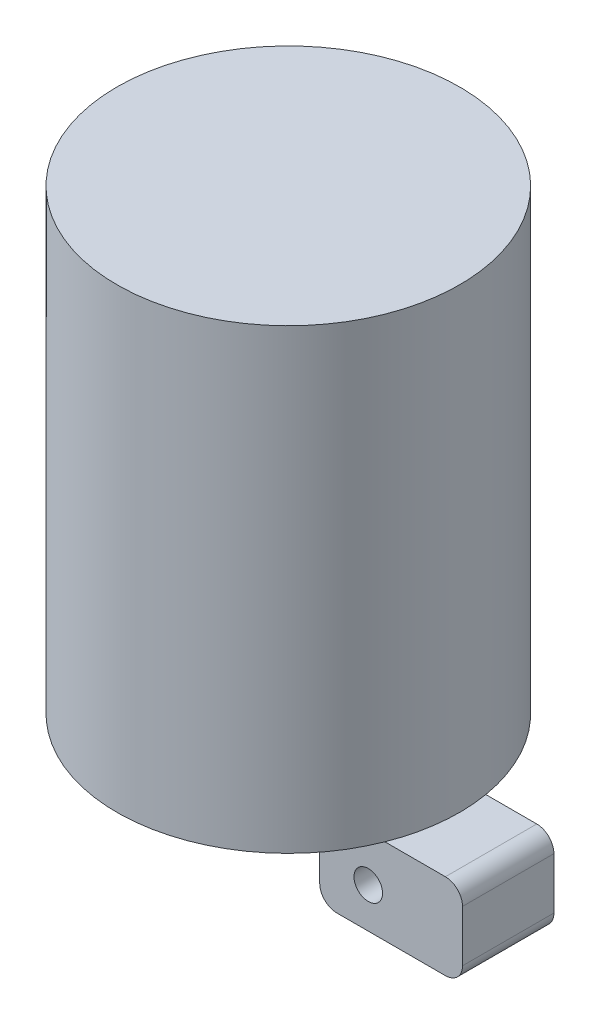
ISO-10303-21;
HEADER;
FILE_DESCRIPTION(('STEP AP214'),'2;1');
FILE_NAME('part.step','',(''),(''),'','','');
FILE_SCHEMA(('AUTOMOTIVE_DESIGN { 1 0 10303 214 1 1 1 1 }'));
ENDSEC;
DATA;
#1=APPLICATION_CONTEXT('core data for automotive mechanical design processes');
#2=APPLICATION_PROTOCOL_DEFINITION('international standard','automotive_design',2000,#1);
#3=PRODUCT_CONTEXT('',#1,'mechanical');
#4=PRODUCT('Part','Part','',(#3));
#5=PRODUCT_RELATED_PRODUCT_CATEGORY('part','',(#4));
#6=PRODUCT_DEFINITION_FORMATION('','',#4);
#7=PRODUCT_DEFINITION_CONTEXT('part definition',#1,'design');
#8=PRODUCT_DEFINITION('design','',#6,#7);
#9=PRODUCT_DEFINITION_SHAPE('','',#8);
#10=(LENGTH_UNIT() NAMED_UNIT(*) SI_UNIT(.MILLI.,.METRE.));
#11=(NAMED_UNIT(*) PLANE_ANGLE_UNIT() SI_UNIT($,.RADIAN.));
#12=(NAMED_UNIT(*) SI_UNIT($,.STERADIAN.) SOLID_ANGLE_UNIT());
#13=UNCERTAINTY_MEASURE_WITH_UNIT(LENGTH_MEASURE(1.E-05),#10,'distance_accuracy_value','');
#14=(GEOMETRIC_REPRESENTATION_CONTEXT(3) GLOBAL_UNCERTAINTY_ASSIGNED_CONTEXT((#13)) GLOBAL_UNIT_ASSIGNED_CONTEXT((#10,
#11,#12)) REPRESENTATION_CONTEXT('',''));
#15=CARTESIAN_POINT('',(0.,0.,0.));
#16=DIRECTION('',(0.,0.,1.));
#17=DIRECTION('',(1.,0.,0.));
#18=AXIS2_PLACEMENT_3D('',#15,#16,#17);
#19=CARTESIAN_POINT('',(0.,0.,0.));
#20=DIRECTION('',(0.,1.,0.));
#21=DIRECTION('',(-1.,0.,0.));
#22=AXIS2_PLACEMENT_3D('',#19,#20,#21);
#23=PLANE('',#22);
#24=CARTESIAN_POINT('',(30.,0.,0.));
#25=DIRECTION('',(0.,1.,0.));
#26=DIRECTION('',(-1.,0.,0.));
#27=AXIS2_PLACEMENT_3D('',#24,#25,#26);
#28=CIRCLE('',#27,12.5);
#29=CARTESIAN_POINT('',(17.5,0.,0.));
#30=VERTEX_POINT('',#29);
#31=EDGE_CURVE('E45',#30,#30,#28,.T.);
#32=ORIENTED_EDGE('',*,*,#31,.T.);
#33=EDGE_LOOP('',(#32));
#34=FACE_BOUND('',#33,.T.);
#35=DIRECTION('',(-1.,0.,0.));
#36=VECTOR('',#35,1.);
#37=CARTESIAN_POINT('',(68.5,0.,-5.));
#38=LINE('',#37,#36);
#39=CARTESIAN_POINT('',(59.5803989154981,0.,-5.));
#40=VERTEX_POINT('',#39);
#41=CARTESIAN_POINT('',(46.5,0.,-5.));
#42=VERTEX_POINT('',#41);
#43=EDGE_CURVE('E126',#40,#42,#38,.T.);
#44=ORIENTED_EDGE('',*,*,#43,.T.);
#45=DIRECTION('',(0.,0.,1.));
#46=VECTOR('',#45,1.);
#47=CARTESIAN_POINT('',(46.5,0.,-5.));
#48=LINE('',#47,#46);
#49=CARTESIAN_POINT('',(46.5,0.,11.));
#50=VERTEX_POINT('',#49);
#51=EDGE_CURVE('E120',#42,#50,#48,.T.);
#52=ORIENTED_EDGE('',*,*,#51,.T.);
#53=DIRECTION('',(-1.,0.,0.));
#54=VECTOR('',#53,1.);
#55=CARTESIAN_POINT('',(68.5,0.,11.));
#56=LINE('',#55,#54);
#57=CARTESIAN_POINT('',(57.9105714739057,0.,11.));
#58=VERTEX_POINT('',#57);
#59=EDGE_CURVE('E102',#58,#50,#56,.T.);
#60=ORIENTED_EDGE('',*,*,#59,.F.);
#61=CARTESIAN_POINT('',(30.,0.,0.));
#62=DIRECTION('',(0.,1.,0.));
#63=DIRECTION('',(-1.,0.,0.));
#64=AXIS2_PLACEMENT_3D('',#61,#62,#63);
#65=CIRCLE('',#64,30.);
#66=EDGE_CURVE('E139',#40,#58,#65,.T.);
#67=ORIENTED_EDGE('',*,*,#66,.F.);
#68=EDGE_LOOP('',(#44,#52,#60,#67));
#69=FACE_BOUND('',#68,.T.);
#70=ADVANCED_FACE('F37',(#34,#69),#23,.F.);
#71=CARTESIAN_POINT('',(0.,80.,0.));
#72=DIRECTION('',(0.,1.,0.));
#73=DIRECTION('',(-1.,0.,0.));
#74=AXIS2_PLACEMENT_3D('',#71,#72,#73);
#75=PLANE('',#74);
#76=CARTESIAN_POINT('',(30.,80.,0.));
#77=DIRECTION('',(0.,1.,0.));
#78=DIRECTION('',(-1.,0.,0.));
#79=AXIS2_PLACEMENT_3D('',#76,#77,#78);
#80=CIRCLE('',#79,30.);
#81=CARTESIAN_POINT('',(0.,80.,0.));
#82=VERTEX_POINT('',#81);
#83=EDGE_CURVE('E136',#82,#82,#80,.T.);
#84=ORIENTED_EDGE('',*,*,#83,.T.);
#85=EDGE_LOOP('',(#84));
#86=FACE_BOUND('',#85,.T.);
#87=ADVANCED_FACE('F39',(#86),#75,.T.);
#88=CARTESIAN_POINT('',(0.,40.,0.));
#89=DIRECTION('',(0.,1.,0.));
#90=DIRECTION('',(-1.,0.,0.));
#91=AXIS2_PLACEMENT_3D('',#88,#89,#90);
#92=PLANE('',#91);
#93=CARTESIAN_POINT('',(30.,40.,0.));
#94=DIRECTION('',(0.,1.,0.));
#95=DIRECTION('',(-1.,0.,0.));
#96=AXIS2_PLACEMENT_3D('',#93,#94,#95);
#97=CIRCLE('',#96,12.5);
#98=CARTESIAN_POINT('',(17.5,40.,0.));
#99=VERTEX_POINT('',#98);
#100=EDGE_CURVE('E11',#99,#99,#97,.T.);
#101=ORIENTED_EDGE('',*,*,#100,.F.);
#102=EDGE_LOOP('',(#101));
#103=FACE_BOUND('',#102,.T.);
#104=ADVANCED_FACE('F148',(#103),#92,.F.);
#105=CARTESIAN_POINT('',(30.,80.,0.));
#106=DIRECTION('',(0.,1.,0.));
#107=DIRECTION('',(-1.,0.,0.));
#108=AXIS2_PLACEMENT_3D('',#105,#106,#107);
#109=CYLINDRICAL_SURFACE('',#108,12.5);
#110=ORIENTED_EDGE('',*,*,#100,.T.);
#111=EDGE_LOOP('',(#110));
#112=FACE_BOUND('',#111,.T.);
#113=ORIENTED_EDGE('',*,*,#31,.F.);
#114=EDGE_LOOP('',(#113));
#115=FACE_BOUND('',#114,.T.);
#116=ADVANCED_FACE('F145',(#112,#115),#109,.F.);
#117=CARTESIAN_POINT('',(30.,80.,0.));
#118=DIRECTION('',(0.,1.,0.));
#119=DIRECTION('',(-1.,0.,0.));
#120=AXIS2_PLACEMENT_3D('',#117,#118,#119);
#121=CYLINDRICAL_SURFACE('',#120,30.);
#122=EDGE_CURVE('E57',#58,#40,#65,.T.);
#123=ORIENTED_EDGE('',*,*,#122,.T.);
#124=ORIENTED_EDGE('',*,*,#66,.T.);
#125=EDGE_LOOP('',(#123,#124));
#126=FACE_BOUND('',#125,.T.);
#127=ORIENTED_EDGE('',*,*,#83,.F.);
#128=EDGE_LOOP('',(#127));
#129=FACE_BOUND('',#128,.T.);
#130=ADVANCED_FACE('F147',(#126,#129),#121,.T.);
#131=CARTESIAN_POINT('',(68.5,0.,-5.));
#132=DIRECTION('',(0.,1.,0.));
#133=DIRECTION('',(-1.,0.,0.));
#134=AXIS2_PLACEMENT_3D('',#131,#132,#133);
#135=PLANE('',#134);
#136=CARTESIAN_POINT('',(68.5,0.,-5.));
#137=VERTEX_POINT('',#136);
#138=EDGE_CURVE('E52',#137,#40,#38,.T.);
#139=ORIENTED_EDGE('',*,*,#138,.T.);
#140=ORIENTED_EDGE('',*,*,#122,.F.);
#141=CARTESIAN_POINT('',(68.5,0.,11.));
#142=VERTEX_POINT('',#141);
#143=EDGE_CURVE('E110',#142,#58,#56,.T.);
#144=ORIENTED_EDGE('',*,*,#143,.F.);
#145=DIRECTION('',(0.,0.,1.));
#146=VECTOR('',#145,1.);
#147=CARTESIAN_POINT('',(68.5,0.,-5.));
#148=LINE('',#147,#146);
#149=EDGE_CURVE('E140',#137,#142,#148,.T.);
#150=ORIENTED_EDGE('',*,*,#149,.F.);
#151=EDGE_LOOP('',(#139,#140,#144,#150));
#152=FACE_BOUND('',#151,.T.);
#153=ADVANCED_FACE('F155',(#152),#135,.T.);
#154=CARTESIAN_POINT('',(68.5,-3.,-5.));
#155=DIRECTION('',(0.,0.,1.));
#156=DIRECTION('',(1.,0.,0.));
#157=AXIS2_PLACEMENT_3D('',#154,#155,#156);
#158=CYLINDRICAL_SURFACE('',#157,3.);
#159=ORIENTED_EDGE('',*,*,#149,.T.);
#160=CARTESIAN_POINT('',(68.5,-3.,11.));
#161=DIRECTION('',(0.,0.,1.));
#162=DIRECTION('',(1.,0.,0.));
#163=AXIS2_PLACEMENT_3D('',#160,#161,#162);
#164=CIRCLE('',#163,3.);
#165=CARTESIAN_POINT('',(71.5,-3.00000000000002,11.));
#166=VERTEX_POINT('',#165);
#167=EDGE_CURVE('E303',#166,#142,#164,.T.);
#168=ORIENTED_EDGE('',*,*,#167,.F.);
#169=DIRECTION('',(0.,0.,1.));
#170=VECTOR('',#169,1.);
#171=CARTESIAN_POINT('',(71.5,-3.00000000000002,-5.));
#172=LINE('',#171,#170);
#173=CARTESIAN_POINT('',(71.5,-3.00000000000002,-5.));
#174=VERTEX_POINT('',#173);
#175=EDGE_CURVE('E321',#174,#166,#172,.T.);
#176=ORIENTED_EDGE('',*,*,#175,.F.);
#177=CARTESIAN_POINT('',(68.5,-3.,-5.));
#178=DIRECTION('',(0.,0.,1.));
#179=DIRECTION('',(1.,0.,0.));
#180=AXIS2_PLACEMENT_3D('',#177,#178,#179);
#181=CIRCLE('',#180,3.);
#182=EDGE_CURVE('E127',#174,#137,#181,.T.);
#183=ORIENTED_EDGE('',*,*,#182,.T.);
#184=EDGE_LOOP('',(#159,#168,#176,#183));
#185=FACE_BOUND('',#184,.T.);
#186=ADVANCED_FACE('F168',(#185),#158,.T.);
#187=CARTESIAN_POINT('',(71.5,-12.,-5.));
#188=DIRECTION('',(1.,0.,0.));
#189=DIRECTION('',(0.,0.,-1.));
#190=AXIS2_PLACEMENT_3D('',#187,#188,#189);
#191=PLANE('',#190);
#192=ORIENTED_EDGE('',*,*,#175,.T.);
#193=DIRECTION('',(0.,1.,0.));
#194=VECTOR('',#193,1.);
#195=CARTESIAN_POINT('',(71.5,-12.,11.));
#196=LINE('',#195,#194);
#197=CARTESIAN_POINT('',(71.5,-12.,11.));
#198=VERTEX_POINT('',#197);
#199=EDGE_CURVE('E300',#198,#166,#196,.T.);
#200=ORIENTED_EDGE('',*,*,#199,.F.);
#201=DIRECTION('',(0.,0.,1.));
#202=VECTOR('',#201,1.);
#203=CARTESIAN_POINT('',(71.5,-12.,-5.));
#204=LINE('',#203,#202);
#205=CARTESIAN_POINT('',(71.5,-12.,-5.));
#206=VERTEX_POINT('',#205);
#207=EDGE_CURVE('E323',#206,#198,#204,.T.);
#208=ORIENTED_EDGE('',*,*,#207,.F.);
#209=DIRECTION('',(0.,1.,0.));
#210=VECTOR('',#209,1.);
#211=CARTESIAN_POINT('',(71.5,-12.,-5.));
#212=LINE('',#211,#210);
#213=EDGE_CURVE('E132',#206,#174,#212,.T.);
#214=ORIENTED_EDGE('',*,*,#213,.T.);
#215=EDGE_LOOP('',(#192,#200,#208,#214));
#216=FACE_BOUND('',#215,.T.);
#217=ADVANCED_FACE('F183',(#216),#191,.T.);
#218=CARTESIAN_POINT('',(68.5,-12.,-5.));
#219=DIRECTION('',(0.,0.,1.));
#220=DIRECTION('',(1.,0.,0.));
#221=AXIS2_PLACEMENT_3D('',#218,#219,#220);
#222=CYLINDRICAL_SURFACE('',#221,3.);
#223=ORIENTED_EDGE('',*,*,#207,.T.);
#224=CARTESIAN_POINT('',(68.5,-12.,11.));
#225=DIRECTION('',(0.,0.,1.));
#226=DIRECTION('',(1.,0.,0.));
#227=AXIS2_PLACEMENT_3D('',#224,#225,#226);
#228=CIRCLE('',#227,3.);
#229=CARTESIAN_POINT('',(68.5,-15.,11.));
#230=VERTEX_POINT('',#229);
#231=EDGE_CURVE('E297',#230,#198,#228,.T.);
#232=ORIENTED_EDGE('',*,*,#231,.F.);
#233=DIRECTION('',(0.,0.,1.));
#234=VECTOR('',#233,1.);
#235=CARTESIAN_POINT('',(68.5,-15.,-5.));
#236=LINE('',#235,#234);
#237=CARTESIAN_POINT('',(68.5,-15.,-5.));
#238=VERTEX_POINT('',#237);
#239=EDGE_CURVE('E325',#238,#230,#236,.T.);
#240=ORIENTED_EDGE('',*,*,#239,.F.);
#241=CARTESIAN_POINT('',(68.5,-12.,-5.));
#242=DIRECTION('',(0.,0.,1.));
#243=DIRECTION('',(1.,0.,0.));
#244=AXIS2_PLACEMENT_3D('',#241,#242,#243);
#245=CIRCLE('',#244,3.);
#246=EDGE_CURVE('E315',#238,#206,#245,.T.);
#247=ORIENTED_EDGE('',*,*,#246,.T.);
#248=EDGE_LOOP('',(#223,#232,#240,#247));
#249=FACE_BOUND('',#248,.T.);
#250=ADVANCED_FACE('F179',(#249),#222,.T.);
#251=CARTESIAN_POINT('',(49.5,-15.,-5.));
#252=DIRECTION('',(0.,-1.,0.));
#253=DIRECTION('',(1.,0.,0.));
#254=AXIS2_PLACEMENT_3D('',#251,#252,#253);
#255=PLANE('',#254);
#256=ORIENTED_EDGE('',*,*,#239,.T.);
#257=DIRECTION('',(1.,0.,0.));
#258=VECTOR('',#257,1.);
#259=CARTESIAN_POINT('',(49.5,-15.,11.));
#260=LINE('',#259,#258);
#261=CARTESIAN_POINT('',(49.5,-15.,11.));
#262=VERTEX_POINT('',#261);
#263=EDGE_CURVE('E294',#262,#230,#260,.T.);
#264=ORIENTED_EDGE('',*,*,#263,.F.);
#265=DIRECTION('',(0.,0.,1.));
#266=VECTOR('',#265,1.);
#267=CARTESIAN_POINT('',(49.5,-15.,-5.));
#268=LINE('',#267,#266);
#269=CARTESIAN_POINT('',(49.5,-15.,-5.));
#270=VERTEX_POINT('',#269);
#271=EDGE_CURVE('E129',#270,#262,#268,.T.);
#272=ORIENTED_EDGE('',*,*,#271,.F.);
#273=DIRECTION('',(1.,0.,0.));
#274=VECTOR('',#273,1.);
#275=CARTESIAN_POINT('',(49.5,-15.,-5.));
#276=LINE('',#275,#274);
#277=EDGE_CURVE('E312',#270,#238,#276,.T.);
#278=ORIENTED_EDGE('',*,*,#277,.T.);
#279=EDGE_LOOP('',(#256,#264,#272,#278));
#280=FACE_BOUND('',#279,.T.);
#281=ADVANCED_FACE('F175',(#280),#255,.T.);
#282=CARTESIAN_POINT('',(49.5,-12.,-5.));
#283=DIRECTION('',(0.,0.,1.));
#284=DIRECTION('',(1.,0.,0.));
#285=AXIS2_PLACEMENT_3D('',#282,#283,#284);
#286=CYLINDRICAL_SURFACE('',#285,3.);
#287=ORIENTED_EDGE('',*,*,#271,.T.);
#288=CARTESIAN_POINT('',(49.5,-12.,11.));
#289=DIRECTION('',(0.,0.,1.));
#290=DIRECTION('',(1.,0.,0.));
#291=AXIS2_PLACEMENT_3D('',#288,#289,#290);
#292=CIRCLE('',#291,3.);
#293=CARTESIAN_POINT('',(46.5,-12.,11.));
#294=VERTEX_POINT('',#293);
#295=EDGE_CURVE('E123',#294,#262,#292,.T.);
#296=ORIENTED_EDGE('',*,*,#295,.F.);
#297=DIRECTION('',(0.,0.,1.));
#298=VECTOR('',#297,1.);
#299=CARTESIAN_POINT('',(46.5,-12.,-5.));
#300=LINE('',#299,#298);
#301=CARTESIAN_POINT('',(46.5,-12.,-5.));
#302=VERTEX_POINT('',#301);
#303=EDGE_CURVE('E122',#302,#294,#300,.T.);
#304=ORIENTED_EDGE('',*,*,#303,.F.);
#305=CARTESIAN_POINT('',(49.5,-12.,-5.));
#306=DIRECTION('',(0.,0.,1.));
#307=DIRECTION('',(1.,0.,0.));
#308=AXIS2_PLACEMENT_3D('',#305,#306,#307);
#309=CIRCLE('',#308,3.);
#310=EDGE_CURVE('E309',#302,#270,#309,.T.);
#311=ORIENTED_EDGE('',*,*,#310,.T.);
#312=EDGE_LOOP('',(#287,#296,#304,#311));
#313=FACE_BOUND('',#312,.T.);
#314=ADVANCED_FACE('F172',(#313),#286,.T.);
#315=CARTESIAN_POINT('',(46.5,0.,-5.));
#316=DIRECTION('',(-1.,0.,0.));
#317=DIRECTION('',(0.,-1.,0.));
#318=AXIS2_PLACEMENT_3D('',#315,#316,#317);
#319=PLANE('',#318);
#320=ORIENTED_EDGE('',*,*,#303,.T.);
#321=DIRECTION('',(0.,-1.,0.));
#322=VECTOR('',#321,1.);
#323=CARTESIAN_POINT('',(46.5,0.,11.));
#324=LINE('',#323,#322);
#325=EDGE_CURVE('E107',#50,#294,#324,.T.);
#326=ORIENTED_EDGE('',*,*,#325,.F.);
#327=ORIENTED_EDGE('',*,*,#51,.F.);
#328=DIRECTION('',(0.,-1.,0.));
#329=VECTOR('',#328,1.);
#330=CARTESIAN_POINT('',(46.5,0.,-5.));
#331=LINE('',#330,#329);
#332=EDGE_CURVE('E307',#42,#302,#331,.T.);
#333=ORIENTED_EDGE('',*,*,#332,.T.);
#334=EDGE_LOOP('',(#320,#326,#327,#333));
#335=FACE_BOUND('',#334,.T.);
#336=ADVANCED_FACE('F118',(#335),#319,.T.);
#337=CARTESIAN_POINT('',(49.5,-12.,-5.));
#338=DIRECTION('',(0.,0.,1.));
#339=DIRECTION('',(1.,0.,0.));
#340=AXIS2_PLACEMENT_3D('',#337,#338,#339);
#341=PLANE('',#340);
#342=CARTESIAN_POINT('',(55.,-8.,-5.));
#343=DIRECTION('',(0.,0.,1.));
#344=DIRECTION('',(1.,0.,0.));
#345=AXIS2_PLACEMENT_3D('',#342,#343,#344);
#346=CIRCLE('',#345,2.5);
#347=CARTESIAN_POINT('',(57.5,-8.,-5.));
#348=VERTEX_POINT('',#347);
#349=EDGE_CURVE('E288',#348,#348,#346,.T.);
#350=ORIENTED_EDGE('',*,*,#349,.T.);
#351=EDGE_LOOP('',(#350));
#352=FACE_BOUND('',#351,.T.);
#353=ORIENTED_EDGE('',*,*,#138,.F.);
#354=ORIENTED_EDGE('',*,*,#182,.F.);
#355=ORIENTED_EDGE('',*,*,#213,.F.);
#356=ORIENTED_EDGE('',*,*,#246,.F.);
#357=ORIENTED_EDGE('',*,*,#277,.F.);
#358=ORIENTED_EDGE('',*,*,#310,.F.);
#359=ORIENTED_EDGE('',*,*,#332,.F.);
#360=ORIENTED_EDGE('',*,*,#43,.F.);
#361=EDGE_LOOP('',(#353,#354,#355,#356,#357,#358,#359,#360));
#362=FACE_BOUND('',#361,.T.);
#363=ADVANCED_FACE('F171',(#352,#362),#341,.F.);
#364=CARTESIAN_POINT('',(55.,-8.,-5.));
#365=DIRECTION('',(0.,0.,1.));
#366=DIRECTION('',(1.,0.,0.));
#367=AXIS2_PLACEMENT_3D('',#364,#365,#366);
#368=CYLINDRICAL_SURFACE('',#367,2.5);
#369=ORIENTED_EDGE('',*,*,#349,.F.);
#370=EDGE_LOOP('',(#369));
#371=FACE_BOUND('',#370,.T.);
#372=CARTESIAN_POINT('',(55.,-8.,11.));
#373=DIRECTION('',(0.,0.,1.));
#374=DIRECTION('',(1.,0.,0.));
#375=AXIS2_PLACEMENT_3D('',#372,#373,#374);
#376=CIRCLE('',#375,2.5);
#377=CARTESIAN_POINT('',(57.5,-8.,11.));
#378=VERTEX_POINT('',#377);
#379=EDGE_CURVE('E115',#378,#378,#376,.T.);
#380=ORIENTED_EDGE('',*,*,#379,.T.);
#381=EDGE_LOOP('',(#380));
#382=FACE_BOUND('',#381,.T.);
#383=ADVANCED_FACE('F193',(#371,#382),#368,.F.);
#384=CARTESIAN_POINT('',(49.5,-12.,11.));
#385=DIRECTION('',(0.,0.,1.));
#386=DIRECTION('',(1.,0.,0.));
#387=AXIS2_PLACEMENT_3D('',#384,#385,#386);
#388=PLANE('',#387);
#389=ORIENTED_EDGE('',*,*,#143,.T.);
#390=ORIENTED_EDGE('',*,*,#59,.T.);
#391=ORIENTED_EDGE('',*,*,#325,.T.);
#392=ORIENTED_EDGE('',*,*,#295,.T.);
#393=ORIENTED_EDGE('',*,*,#263,.T.);
#394=ORIENTED_EDGE('',*,*,#231,.T.);
#395=ORIENTED_EDGE('',*,*,#199,.T.);
#396=ORIENTED_EDGE('',*,*,#167,.T.);
#397=EDGE_LOOP('',(#389,#390,#391,#392,#393,#394,#395,#396));
#398=FACE_BOUND('',#397,.T.);
#399=ORIENTED_EDGE('',*,*,#379,.F.);
#400=EDGE_LOOP('',(#399));
#401=FACE_BOUND('',#400,.T.);
#402=ADVANCED_FACE('F104',(#398,#401),#388,.T.);
#403=CLOSED_SHELL('',(#70,#87,#104,#116,#130,#153,#186,#217,#250,#281,#314,#336,#363,#383,#402));
#404=MANIFOLD_SOLID_BREP('B2',#403);
#405=ADVANCED_BREP_SHAPE_REPRESENTATION('',(#18,#404),#14);
#406=SHAPE_DEFINITION_REPRESENTATION(#9,#405);
ENDSEC;
END-ISO-10303-21;
